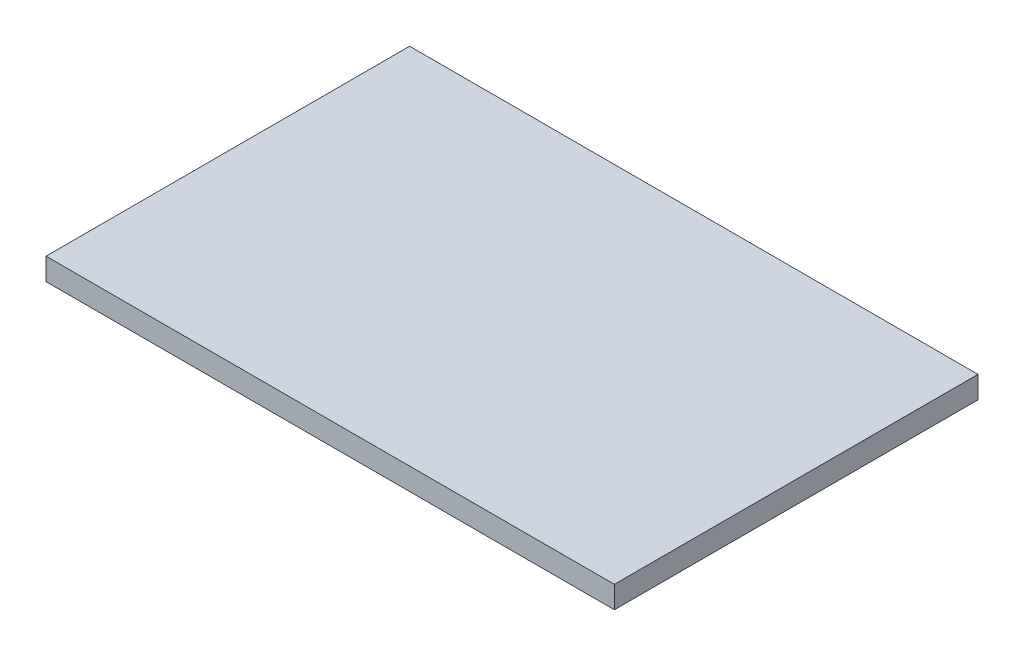
ISO-10303-21;
HEADER;
FILE_DESCRIPTION(('STEP AP214'),'2;1');
FILE_NAME('part.step','',(''),(''),'','','');
FILE_SCHEMA(('AUTOMOTIVE_DESIGN { 1 0 10303 214 1 1 1 1 }'));
ENDSEC;
DATA;
#1=APPLICATION_CONTEXT('core data for automotive mechanical design processes');
#2=APPLICATION_PROTOCOL_DEFINITION('international standard','automotive_design',2000,#1);
#3=PRODUCT_CONTEXT('',#1,'mechanical');
#4=PRODUCT('Part','Part','',(#3));
#5=PRODUCT_RELATED_PRODUCT_CATEGORY('part','',(#4));
#6=PRODUCT_DEFINITION_FORMATION('','',#4);
#7=PRODUCT_DEFINITION_CONTEXT('part definition',#1,'design');
#8=PRODUCT_DEFINITION('design','',#6,#7);
#9=PRODUCT_DEFINITION_SHAPE('','',#8);
#10=(LENGTH_UNIT() NAMED_UNIT(*) SI_UNIT(.MILLI.,.METRE.));
#11=(NAMED_UNIT(*) PLANE_ANGLE_UNIT() SI_UNIT($,.RADIAN.));
#12=(NAMED_UNIT(*) SI_UNIT($,.STERADIAN.) SOLID_ANGLE_UNIT());
#13=UNCERTAINTY_MEASURE_WITH_UNIT(LENGTH_MEASURE(1.E-05),#10,'distance_accuracy_value','');
#14=(GEOMETRIC_REPRESENTATION_CONTEXT(3) GLOBAL_UNCERTAINTY_ASSIGNED_CONTEXT((#13)) GLOBAL_UNIT_ASSIGNED_CONTEXT((#10,
#11,#12)) REPRESENTATION_CONTEXT('',''));
#15=CARTESIAN_POINT('',(0.,0.,0.));
#16=DIRECTION('',(0.,0.,1.));
#17=DIRECTION('',(1.,0.,0.));
#18=AXIS2_PLACEMENT_3D('',#15,#16,#17);
#19=CARTESIAN_POINT('',(-4.68929974,-0.18199862,6.0000007));
#20=DIRECTION('',(0.,0.,-1.));
#21=DIRECTION('',(0.,-1.,0.));
#22=AXIS2_PLACEMENT_3D('',#19,#20,#21);
#23=PLANE('',#22);
#24=DIRECTION('',(1.,0.,0.));
#25=VECTOR('',#24,1.);
#26=CARTESIAN_POINT('',(-4.68929974,-0.18199862,6.0000007));
#27=LINE('',#26,#25);
#28=CARTESIAN_POINT('',(-4.68929974,-0.18199862,6.0000007));
#29=VERTEX_POINT('',#28);
#30=CARTESIAN_POINT('',(4.68929974,-0.18199862,6.0000007));
#31=VERTEX_POINT('',#30);
#32=EDGE_CURVE('E97',#29,#31,#27,.T.);
#33=ORIENTED_EDGE('',*,*,#32,.T.);
#34=DIRECTION('',(0.,1.,0.));
#35=VECTOR('',#34,1.);
#36=CARTESIAN_POINT('',(4.68929974,-0.18199862,6.0000007));
#37=LINE('',#36,#35);
#38=CARTESIAN_POINT('',(4.68929974,0.18200116,6.0000007));
#39=VERTEX_POINT('',#38);
#40=EDGE_CURVE('E78',#31,#39,#37,.T.);
#41=ORIENTED_EDGE('',*,*,#40,.T.);
#42=DIRECTION('',(-1.,0.,0.));
#43=VECTOR('',#42,1.);
#44=CARTESIAN_POINT('',(4.68929974,0.18200116,6.0000007));
#45=LINE('',#44,#43);
#46=CARTESIAN_POINT('',(-4.68929974,0.18200116,6.0000007));
#47=VERTEX_POINT('',#46);
#48=EDGE_CURVE('E20',#39,#47,#45,.T.);
#49=ORIENTED_EDGE('',*,*,#48,.T.);
#50=DIRECTION('',(0.,-1.,0.));
#51=VECTOR('',#50,1.);
#52=CARTESIAN_POINT('',(-4.68929974,0.18200116,6.0000007));
#53=LINE('',#52,#51);
#54=EDGE_CURVE('E11',#47,#29,#53,.T.);
#55=ORIENTED_EDGE('',*,*,#54,.T.);
#56=EDGE_LOOP('',(#33,#41,#49,#55));
#57=FACE_BOUND('',#56,.T.);
#58=ADVANCED_FACE('F16',(#57),#23,.F.);
#59=CARTESIAN_POINT('',(-4.68929974,-0.18199862,0.));
#60=DIRECTION('',(0.,0.,-1.));
#61=DIRECTION('',(0.,-1.,0.));
#62=AXIS2_PLACEMENT_3D('',#59,#60,#61);
#63=PLANE('',#62);
#64=DIRECTION('',(0.,-1.,0.));
#65=VECTOR('',#64,1.);
#66=CARTESIAN_POINT('',(-4.68929974,0.18200116,0.));
#67=LINE('',#66,#65);
#68=CARTESIAN_POINT('',(-4.68929974,0.18200116,0.));
#69=VERTEX_POINT('',#68);
#70=CARTESIAN_POINT('',(-4.68929974,-0.18199862,0.));
#71=VERTEX_POINT('',#70);
#72=EDGE_CURVE('E27',#69,#71,#67,.T.);
#73=ORIENTED_EDGE('',*,*,#72,.F.);
#74=DIRECTION('',(-1.,0.,0.));
#75=VECTOR('',#74,1.);
#76=CARTESIAN_POINT('',(4.68929974,0.18200116,0.));
#77=LINE('',#76,#75);
#78=CARTESIAN_POINT('',(4.68929974,0.18200116,0.));
#79=VERTEX_POINT('',#78);
#80=EDGE_CURVE('E71',#79,#69,#77,.T.);
#81=ORIENTED_EDGE('',*,*,#80,.F.);
#82=DIRECTION('',(0.,1.,0.));
#83=VECTOR('',#82,1.);
#84=CARTESIAN_POINT('',(4.68929974,-0.18199862,0.));
#85=LINE('',#84,#83);
#86=CARTESIAN_POINT('',(4.68929974,-0.18199862,0.));
#87=VERTEX_POINT('',#86);
#88=EDGE_CURVE('E74',#87,#79,#85,.T.);
#89=ORIENTED_EDGE('',*,*,#88,.F.);
#90=DIRECTION('',(1.,0.,0.));
#91=VECTOR('',#90,1.);
#92=CARTESIAN_POINT('',(-4.68929974,-0.18199862,0.));
#93=LINE('',#92,#91);
#94=EDGE_CURVE('E103',#71,#87,#93,.T.);
#95=ORIENTED_EDGE('',*,*,#94,.F.);
#96=EDGE_LOOP('',(#73,#81,#89,#95));
#97=FACE_BOUND('',#96,.T.);
#98=ADVANCED_FACE('F18',(#97),#63,.T.);
#99=CARTESIAN_POINT('',(-4.68929974,0.18200116,0.));
#100=DIRECTION('',(1.,0.,0.));
#101=DIRECTION('',(0.,1.,0.));
#102=AXIS2_PLACEMENT_3D('',#99,#100,#101);
#103=PLANE('',#102);
#104=ORIENTED_EDGE('',*,*,#72,.T.);
#105=DIRECTION('',(0.,0.,1.));
#106=VECTOR('',#105,1.);
#107=CARTESIAN_POINT('',(-4.68929974,-0.18199862,0.));
#108=LINE('',#107,#106);
#109=EDGE_CURVE('E91',#71,#29,#108,.T.);
#110=ORIENTED_EDGE('',*,*,#109,.T.);
#111=ORIENTED_EDGE('',*,*,#54,.F.);
#112=DIRECTION('',(0.,0.,1.));
#113=VECTOR('',#112,1.);
#114=CARTESIAN_POINT('',(-4.68929974,0.18200116,0.));
#115=LINE('',#114,#113);
#116=EDGE_CURVE('E77',#69,#47,#115,.T.);
#117=ORIENTED_EDGE('',*,*,#116,.F.);
#118=EDGE_LOOP('',(#104,#110,#111,#117));
#119=FACE_BOUND('',#118,.T.);
#120=ADVANCED_FACE('F126',(#119),#103,.F.);
#121=CARTESIAN_POINT('',(4.68929974,0.18200116,0.));
#122=DIRECTION('',(0.,-1.,0.));
#123=DIRECTION('',(0.,0.,-1.));
#124=AXIS2_PLACEMENT_3D('',#121,#122,#123);
#125=PLANE('',#124);
#126=ORIENTED_EDGE('',*,*,#80,.T.);
#127=ORIENTED_EDGE('',*,*,#116,.T.);
#128=ORIENTED_EDGE('',*,*,#48,.F.);
#129=DIRECTION('',(0.,0.,1.));
#130=VECTOR('',#129,1.);
#131=CARTESIAN_POINT('',(4.68929974,0.18200116,0.));
#132=LINE('',#131,#130);
#133=EDGE_CURVE('E81',#79,#39,#132,.T.);
#134=ORIENTED_EDGE('',*,*,#133,.F.);
#135=EDGE_LOOP('',(#126,#127,#128,#134));
#136=FACE_BOUND('',#135,.T.);
#137=ADVANCED_FACE('F82',(#136),#125,.F.);
#138=CARTESIAN_POINT('',(4.68929974,-0.18199862,0.));
#139=DIRECTION('',(-1.,0.,0.));
#140=DIRECTION('',(0.,0.,1.));
#141=AXIS2_PLACEMENT_3D('',#138,#139,#140);
#142=PLANE('',#141);
#143=ORIENTED_EDGE('',*,*,#88,.T.);
#144=ORIENTED_EDGE('',*,*,#133,.T.);
#145=ORIENTED_EDGE('',*,*,#40,.F.);
#146=DIRECTION('',(0.,0.,1.));
#147=VECTOR('',#146,1.);
#148=CARTESIAN_POINT('',(4.68929974,-0.18199862,0.));
#149=LINE('',#148,#147);
#150=EDGE_CURVE('E88',#87,#31,#149,.T.);
#151=ORIENTED_EDGE('',*,*,#150,.F.);
#152=EDGE_LOOP('',(#143,#144,#145,#151));
#153=FACE_BOUND('',#152,.T.);
#154=ADVANCED_FACE('F86',(#153),#142,.F.);
#155=CARTESIAN_POINT('',(-4.68929974,-0.18199862,0.));
#156=DIRECTION('',(0.,1.,0.));
#157=DIRECTION('',(1.,0.,0.));
#158=AXIS2_PLACEMENT_3D('',#155,#156,#157);
#159=PLANE('',#158);
#160=ORIENTED_EDGE('',*,*,#94,.T.);
#161=ORIENTED_EDGE('',*,*,#150,.T.);
#162=ORIENTED_EDGE('',*,*,#32,.F.);
#163=ORIENTED_EDGE('',*,*,#109,.F.);
#164=EDGE_LOOP('',(#160,#161,#162,#163));
#165=FACE_BOUND('',#164,.T.);
#166=ADVANCED_FACE('F117',(#165),#159,.F.);
#167=CLOSED_SHELL('',(#58,#98,#120,#137,#154,#166));
#168=MANIFOLD_SOLID_BREP('B1',#167);
#169=ADVANCED_BREP_SHAPE_REPRESENTATION('',(#18,#168),#14);
#170=SHAPE_DEFINITION_REPRESENTATION(#9,#169);
ENDSEC;
END-ISO-10303-21;
